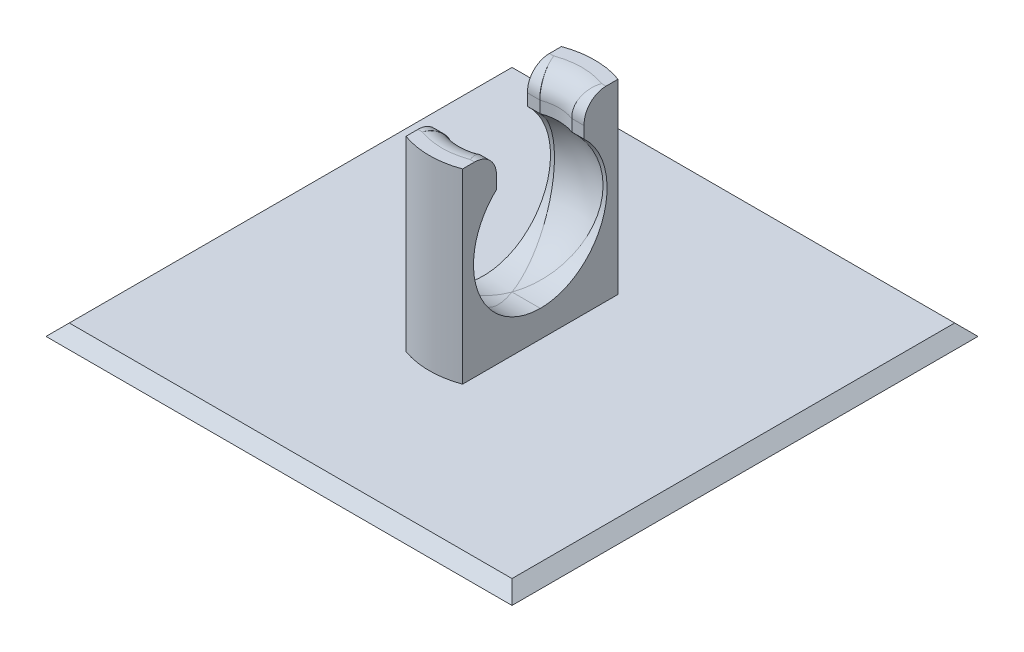
ISO-10303-21;
HEADER;
FILE_DESCRIPTION(('STEP AP214'),'2;1');
FILE_NAME('part.step','',(''),(''),'','','');
FILE_SCHEMA(('AUTOMOTIVE_DESIGN { 1 0 10303 214 1 1 1 1 }'));
ENDSEC;
DATA;
#1=APPLICATION_CONTEXT('core data for automotive mechanical design processes');
#2=APPLICATION_PROTOCOL_DEFINITION('international standard','automotive_design',2000,#1);
#3=PRODUCT_CONTEXT('',#1,'mechanical');
#4=PRODUCT('Part','Part','',(#3));
#5=PRODUCT_RELATED_PRODUCT_CATEGORY('part','',(#4));
#6=PRODUCT_DEFINITION_FORMATION('','',#4);
#7=PRODUCT_DEFINITION_CONTEXT('part definition',#1,'design');
#8=PRODUCT_DEFINITION('design','',#6,#7);
#9=PRODUCT_DEFINITION_SHAPE('','',#8);
#10=(LENGTH_UNIT() NAMED_UNIT(*) SI_UNIT(.MILLI.,.METRE.));
#11=(NAMED_UNIT(*) PLANE_ANGLE_UNIT() SI_UNIT($,.RADIAN.));
#12=(NAMED_UNIT(*) SI_UNIT($,.STERADIAN.) SOLID_ANGLE_UNIT());
#13=UNCERTAINTY_MEASURE_WITH_UNIT(LENGTH_MEASURE(1.E-05),#10,'distance_accuracy_value','');
#14=(GEOMETRIC_REPRESENTATION_CONTEXT(3) GLOBAL_UNCERTAINTY_ASSIGNED_CONTEXT((#13)) GLOBAL_UNIT_ASSIGNED_CONTEXT((#10,
#11,#12)) REPRESENTATION_CONTEXT('',''));
#15=CARTESIAN_POINT('',(0.,0.,0.));
#16=DIRECTION('',(0.,0.,1.));
#17=DIRECTION('',(1.,0.,0.));
#18=AXIS2_PLACEMENT_3D('',#15,#16,#17);
#19=CARTESIAN_POINT('',(0.,-42.,0.));
#20=DIRECTION('',(0.,-1.,0.));
#21=DIRECTION('',(0.,0.,-1.));
#22=AXIS2_PLACEMENT_3D('',#19,#20,#21);
#23=CYLINDRICAL_SURFACE('',#22,20.0312256240101);
#24=CARTESIAN_POINT('',(0.,28.,0.));
#25=DIRECTION('',(0.,-1.,0.));
#26=DIRECTION('',(0.,0.,-1.));
#27=AXIS2_PLACEMENT_3D('',#24,#25,#26);
#28=CIRCLE('',#27,20.0312256240101);
#29=CARTESIAN_POINT('',(6.85108265891278,28.,18.8231949041799));
#30=VERTEX_POINT('',#29);
#31=CARTESIAN_POINT('',(-6.85108265891277,28.,18.8231949041799));
#32=VERTEX_POINT('',#31);
#33=EDGE_CURVE('E491',#30,#32,#28,.T.);
#34=ORIENTED_EDGE('',*,*,#33,.F.);
#35=DIRECTION('',(0.,1.,0.));
#36=VECTOR('',#35,1.);
#37=CARTESIAN_POINT('',(6.85108265891276,0.,18.8231949041799));
#38=LINE('',#37,#36);
#39=CARTESIAN_POINT('',(6.85108265891277,23.,18.8231949041799));
#40=VERTEX_POINT('',#39);
#41=EDGE_CURVE('E484',#40,#30,#38,.T.);
#42=ORIENTED_EDGE('',*,*,#41,.F.);
#43=CARTESIAN_POINT('',(0.,23.,0.));
#44=DIRECTION('',(0.,-1.,0.));
#45=DIRECTION('',(0.,0.,-1.));
#46=AXIS2_PLACEMENT_3D('',#43,#44,#45);
#47=CIRCLE('',#46,20.0312256240101);
#48=CARTESIAN_POINT('',(-6.85108265891276,23.,18.8231949041799));
#49=VERTEX_POINT('',#48);
#50=EDGE_CURVE('E511',#40,#49,#47,.T.);
#51=ORIENTED_EDGE('',*,*,#50,.T.);
#52=DIRECTION('',(0.,1.,0.));
#53=VECTOR('',#52,1.);
#54=CARTESIAN_POINT('',(-6.85108265891276,0.,18.8231949041799));
#55=LINE('',#54,#53);
#56=EDGE_CURVE('E493',#49,#32,#55,.T.);
#57=ORIENTED_EDGE('',*,*,#56,.T.);
#58=EDGE_LOOP('',(#34,#42,#51,#57));
#59=FACE_BOUND('',#58,.T.);
#60=ADVANCED_FACE('F49',(#59),#23,.F.);
#61=CARTESIAN_POINT('',(0.,28.,0.));
#62=DIRECTION('',(0.,-1.,0.));
#63=DIRECTION('',(0.,0.,-1.));
#64=AXIS2_PLACEMENT_3D('',#61,#62,#63);
#65=TOROIDAL_SURFACE('',#64,30.0312256240101,10.);
#66=CARTESIAN_POINT('',(0.,38.,0.));
#67=DIRECTION('',(0.,-1.,0.));
#68=DIRECTION('',(0.,0.,-1.));
#69=AXIS2_PLACEMENT_3D('',#66,#67,#68);
#70=CIRCLE('',#69,30.0312256240101);
#71=CARTESIAN_POINT('',(10.2712840921695,38.,28.220121112039));
#72=VERTEX_POINT('',#71);
#73=CARTESIAN_POINT('',(-10.2712840921695,38.,28.220121112039));
#74=VERTEX_POINT('',#73);
#75=EDGE_CURVE('E497',#72,#74,#70,.T.);
#76=ORIENTED_EDGE('',*,*,#75,.F.);
#77=CARTESIAN_POINT('',(10.2712840921695,28.,28.220121112039));
#78=DIRECTION('',(0.939692620785908,0.,-0.342020143325669));
#79=DIRECTION('',(-0.342020143325669,0.,-0.939692620785908));
#80=AXIS2_PLACEMENT_3D('',#77,#78,#79);
#81=CIRCLE('',#80,10.);
#82=EDGE_CURVE('E470',#30,#72,#81,.T.);
#83=ORIENTED_EDGE('',*,*,#82,.F.);
#84=ORIENTED_EDGE('',*,*,#33,.T.);
#85=CARTESIAN_POINT('',(-10.2712840921695,28.,28.220121112039));
#86=DIRECTION('',(0.939692620785908,0.,0.342020143325669));
#87=DIRECTION('',(0.342020143325669,0.,-0.939692620785908));
#88=AXIS2_PLACEMENT_3D('',#85,#86,#87);
#89=CIRCLE('',#88,10.);
#90=EDGE_CURVE('E563',#32,#74,#89,.T.);
#91=ORIENTED_EDGE('',*,*,#90,.T.);
#92=EDGE_LOOP('',(#76,#83,#84,#91));
#93=FACE_BOUND('',#92,.T.);
#94=ADVANCED_FACE('F414',(#93),#65,.T.);
#95=CARTESIAN_POINT('',(0.,38.,0.));
#96=DIRECTION('',(0.,-1.,0.));
#97=DIRECTION('',(0.,0.,-1.));
#98=AXIS2_PLACEMENT_3D('',#95,#96,#97);
#99=PLANE('',#98);
#100=CARTESIAN_POINT('',(0.,38.,0.));
#101=DIRECTION('',(0.,-1.,0.));
#102=DIRECTION('',(0.,0.,-1.));
#103=AXIS2_PLACEMENT_3D('',#100,#101,#102);
#104=CIRCLE('',#103,35.5);
#105=CARTESIAN_POINT('',(12.1417150880613,38.,33.3590880378997));
#106=VERTEX_POINT('',#105);
#107=CARTESIAN_POINT('',(-12.1417150880613,38.,33.3590880378997));
#108=VERTEX_POINT('',#107);
#109=EDGE_CURVE('E517',#106,#108,#104,.T.);
#110=ORIENTED_EDGE('',*,*,#109,.F.);
#111=DIRECTION('',(0.,0.,1.));
#112=VECTOR('',#111,1.);
#113=CARTESIAN_POINT('',(12.1417150880613,38.0000000000001,1.86981339155973E-13));
#114=LINE('',#113,#112);
#115=CARTESIAN_POINT('',(12.1417150880613,38.,28.220121112039));
#116=VERTEX_POINT('',#115);
#117=EDGE_CURVE('E638',#116,#106,#114,.T.);
#118=ORIENTED_EDGE('',*,*,#117,.F.);
#119=DIRECTION('',(1.,0.,0.));
#120=VECTOR('',#119,1.);
#121=CARTESIAN_POINT('',(-85.7965231203002,38.,28.220121112039));
#122=LINE('',#121,#120);
#123=EDGE_CURVE('E481',#72,#116,#122,.T.);
#124=ORIENTED_EDGE('',*,*,#123,.F.);
#125=ORIENTED_EDGE('',*,*,#75,.T.);
#126=DIRECTION('',(-1.,0.,0.));
#127=VECTOR('',#126,1.);
#128=CARTESIAN_POINT('',(83.3870728119004,38.,28.220121112039));
#129=LINE('',#128,#127);
#130=CARTESIAN_POINT('',(-12.1417150880613,38.,28.220121112039));
#131=VERTEX_POINT('',#130);
#132=EDGE_CURVE('E346',#74,#131,#129,.T.);
#133=ORIENTED_EDGE('',*,*,#132,.T.);
#134=DIRECTION('',(0.,0.,-1.));
#135=VECTOR('',#134,1.);
#136=CARTESIAN_POINT('',(-12.1417150880613,38.0000000000001,1.02619056379434E-13));
#137=LINE('',#136,#135);
#138=EDGE_CURVE('E342',#108,#131,#137,.T.);
#139=ORIENTED_EDGE('',*,*,#138,.F.);
#140=EDGE_LOOP('',(#110,#118,#124,#125,#133,#139));
#141=FACE_BOUND('',#140,.T.);
#142=ADVANCED_FACE('F422',(#141),#99,.F.);
#143=CARTESIAN_POINT('',(0.,-42.,0.));
#144=DIRECTION('',(0.,-1.,0.));
#145=DIRECTION('',(0.,0.,-1.));
#146=AXIS2_PLACEMENT_3D('',#143,#144,#145);
#147=CYLINDRICAL_SURFACE('',#146,35.5);
#148=DIRECTION('',(0.,-1.,0.));
#149=VECTOR('',#148,1.);
#150=CARTESIAN_POINT('',(-12.1417150880613,0.,33.3590880378997));
#151=LINE('',#150,#149);
#152=CARTESIAN_POINT('',(-12.1417150880613,-42.,33.3590880378997));
#153=VERTEX_POINT('',#152);
#154=EDGE_CURVE('E571',#108,#153,#151,.T.);
#155=ORIENTED_EDGE('',*,*,#154,.T.);
#156=CARTESIAN_POINT('',(0.,-42.,0.));
#157=DIRECTION('',(0.,-1.,0.));
#158=DIRECTION('',(0.,0.,-1.));
#159=AXIS2_PLACEMENT_3D('',#156,#157,#158);
#160=CIRCLE('',#159,35.5);
#161=CARTESIAN_POINT('',(12.1417150880613,-42.,33.3590880378997));
#162=VERTEX_POINT('',#161);
#163=EDGE_CURVE('E514',#162,#153,#160,.T.);
#164=ORIENTED_EDGE('',*,*,#163,.F.);
#165=DIRECTION('',(0.,-1.,0.));
#166=VECTOR('',#165,1.);
#167=CARTESIAN_POINT('',(12.1417150880613,0.,33.3590880378997));
#168=LINE('',#167,#166);
#169=EDGE_CURVE('E500',#106,#162,#168,.T.);
#170=ORIENTED_EDGE('',*,*,#169,.F.);
#171=ORIENTED_EDGE('',*,*,#109,.T.);
#172=EDGE_LOOP('',(#155,#164,#170,#171));
#173=FACE_BOUND('',#172,.T.);
#174=ADVANCED_FACE('F418',(#173),#147,.T.);
#175=CARTESIAN_POINT('',(0.,0.,0.));
#176=DIRECTION('',(0.,-1.,0.));
#177=DIRECTION('',(0.342020143325669,0.,0.939692620785908));
#178=AXIS2_PLACEMENT_3D('',#175,#176,#177);
#179=SPHERICAL_SURFACE('',#178,30.5);
#180=CARTESIAN_POINT('',(0.,0.,0.));
#181=DIRECTION('',(0.939692620785908,0.,-0.342020143325669));
#182=DIRECTION('',(-0.342020143325669,0.,-0.939692620785908));
#183=AXIS2_PLACEMENT_3D('',#180,#181,#182);
#184=CIRCLE('',#183,30.5);
#185=CARTESIAN_POINT('',(0.,-30.5,0.));
#186=VERTEX_POINT('',#185);
#187=EDGE_CURVE('E504',#40,#186,#184,.T.);
#188=ORIENTED_EDGE('',*,*,#187,.T.);
#189=CARTESIAN_POINT('',(0.,0.,0.));
#190=DIRECTION('',(0.939692620785908,0.,0.342020143325669));
#191=DIRECTION('',(0.342020143325669,0.,-0.939692620785908));
#192=AXIS2_PLACEMENT_3D('',#189,#190,#191);
#193=CIRCLE('',#192,30.5);
#194=EDGE_CURVE('E488',#49,#186,#193,.T.);
#195=ORIENTED_EDGE('',*,*,#194,.F.);
#196=ORIENTED_EDGE('',*,*,#50,.F.);
#197=EDGE_LOOP('',(#188,#195,#196));
#198=FACE_BOUND('',#197,.T.);
#199=ADVANCED_FACE('F407',(#198),#179,.F.);
#200=CARTESIAN_POINT('',(12.1417150880613,-30.5,0.));
#201=DIRECTION('',(1.,0.,0.));
#202=DIRECTION('',(0.,0.,-1.));
#203=AXIS2_PLACEMENT_3D('',#200,#201,#202);
#204=PLANE('',#203);
#205=CARTESIAN_POINT('',(12.1417150880613,23.,-18.8231949041799));
#206=CARTESIAN_POINT('',(12.1417150880613,0.946783513735665,-42.6177763876831));
#207=CARTESIAN_POINT('',(12.1417150880613,-30.5,-31.5536841411673));
#208=CARTESIAN_POINT('',(12.1417150880613,-30.5,0.));
#209=(BOUNDED_CURVE() B_SPLINE_CURVE(3,(#205,#206,#207,#208),.UNSPECIFIED.,.F.,
.F.) B_SPLINE_CURVE_WITH_KNOTS((4,4),(0.,1.),
.UNSPECIFIED.) CURVE() GEOMETRIC_REPRESENTATION_ITEM() RATIONAL_B_SPLINE_CURVE((1.,
0.567095624439425,0.567095624439425,1.)) REPRESENTATION_ITEM(''));
#210=CARTESIAN_POINT('',(12.1417150880613,23.,-18.8231949041799));
#211=VERTEX_POINT('',#210);
#212=CARTESIAN_POINT('',(12.1417150880613,-30.5,0.));
#213=VERTEX_POINT('',#212);
#214=EDGE_CURVE('E283',#211,#213,#209,.T.);
#215=ORIENTED_EDGE('',*,*,#214,.T.);
#216=CARTESIAN_POINT('',(12.1417150880613,-30.5,0.));
#217=CARTESIAN_POINT('',(12.1417150880613,-30.5,31.5536841411673));
#218=CARTESIAN_POINT('',(12.1417150880613,0.94678351373564,42.6177763876831));
#219=CARTESIAN_POINT('',(12.1417150880613,23.,18.8231949041799));
#220=(BOUNDED_CURVE() B_SPLINE_CURVE(3,(#216,#217,#218,#219),.UNSPECIFIED.,.F.,
.F.) B_SPLINE_CURVE_WITH_KNOTS((4,4),(0.,1.),
.UNSPECIFIED.) CURVE() GEOMETRIC_REPRESENTATION_ITEM() RATIONAL_B_SPLINE_CURVE((1.,
0.567095624439425,0.567095624439425,1.)) REPRESENTATION_ITEM(''));
#221=CARTESIAN_POINT('',(12.1417150880613,23.,18.8231949041799));
#222=VERTEX_POINT('',#221);
#223=EDGE_CURVE('E585',#213,#222,#220,.T.);
#224=ORIENTED_EDGE('',*,*,#223,.T.);
#225=DIRECTION('',(0.,-1.,0.));
#226=VECTOR('',#225,1.);
#227=CARTESIAN_POINT('',(12.1417150880613,-30.5,18.8231949041798));
#228=LINE('',#227,#226);
#229=CARTESIAN_POINT('',(12.1417150880613,28.,18.8231949041799));
#230=VERTEX_POINT('',#229);
#231=EDGE_CURVE('E223',#230,#222,#228,.T.);
#232=ORIENTED_EDGE('',*,*,#231,.F.);
#233=CARTESIAN_POINT('',(12.1417150880613,28.5848888922025,28.220121112039));
#234=DIRECTION('',(1.,0.,0.));
#235=DIRECTION('',(0.,0.,-1.));
#236=AXIS2_PLACEMENT_3D('',#233,#234,#235);
#237=CIRCLE('',#236,9.41511110779745);
#238=EDGE_CURVE('E477',#230,#116,#237,.T.);
#239=ORIENTED_EDGE('',*,*,#238,.T.);
#240=ORIENTED_EDGE('',*,*,#117,.T.);
#241=ORIENTED_EDGE('',*,*,#169,.T.);
#242=DIRECTION('',(0.,0.,1.));
#243=VECTOR('',#242,1.);
#244=CARTESIAN_POINT('',(12.1417150880613,-42.,0.));
#245=LINE('',#244,#243);
#246=CARTESIAN_POINT('',(12.1417150880613,-42.,-33.3590880378997));
#247=VERTEX_POINT('',#246);
#248=EDGE_CURVE('E540',#247,#162,#245,.T.);
#249=ORIENTED_EDGE('',*,*,#248,.F.);
#250=DIRECTION('',(0.,-1.,0.));
#251=VECTOR('',#250,1.);
#252=CARTESIAN_POINT('',(12.1417150880613,0.,-33.3590880378997));
#253=LINE('',#252,#251);
#254=CARTESIAN_POINT('',(12.1417150880613,38.,-33.3590880378997));
#255=VERTEX_POINT('',#254);
#256=EDGE_CURVE('E550',#255,#247,#253,.T.);
#257=ORIENTED_EDGE('',*,*,#256,.F.);
#258=DIRECTION('',(0.,0.,-1.));
#259=VECTOR('',#258,1.);
#260=CARTESIAN_POINT('',(12.1417150880613,38.0000000000001,0.));
#261=LINE('',#260,#259);
#262=CARTESIAN_POINT('',(12.1417150880613,38.,-28.220121112039));
#263=VERTEX_POINT('',#262);
#264=EDGE_CURVE('E279',#263,#255,#261,.T.);
#265=ORIENTED_EDGE('',*,*,#264,.F.);
#266=CARTESIAN_POINT('',(12.1417150880613,28.5848888922026,-28.220121112039));
#267=DIRECTION('',(1.,0.,0.));
#268=DIRECTION('',(0.,0.,-1.));
#269=AXIS2_PLACEMENT_3D('',#266,#267,#268);
#270=CIRCLE('',#269,9.41511110779743);
#271=CARTESIAN_POINT('',(12.1417150880613,28.,-18.8231949041799));
#272=VERTEX_POINT('',#271);
#273=EDGE_CURVE('E275',#263,#272,#270,.T.);
#274=ORIENTED_EDGE('',*,*,#273,.T.);
#275=DIRECTION('',(0.,1.,0.));
#276=VECTOR('',#275,1.);
#277=CARTESIAN_POINT('',(12.1417150880613,-30.5,-18.8231949041798));
#278=LINE('',#277,#276);
#279=EDGE_CURVE('E227',#211,#272,#278,.T.);
#280=ORIENTED_EDGE('',*,*,#279,.F.);
#281=EDGE_LOOP('',(#215,#224,#232,#239,#240,#241,#249,#257,#265,#274,#280));
#282=FACE_BOUND('',#281,.T.);
#283=ADVANCED_FACE('F404',(#282),#204,.T.);
#284=CARTESIAN_POINT('',(-12.1417150880613,-30.5,33.3590880378997));
#285=DIRECTION('',(-1.,0.,0.));
#286=DIRECTION('',(0.,0.,1.));
#287=AXIS2_PLACEMENT_3D('',#284,#285,#286);
#288=PLANE('',#287);
#289=DIRECTION('',(0.,-1.,0.));
#290=VECTOR('',#289,1.);
#291=CARTESIAN_POINT('',(-12.1417150880613,0.,-33.3590880378997));
#292=LINE('',#291,#290);
#293=CARTESIAN_POINT('',(-12.1417150880613,38.,-33.3590880378997));
#294=VERTEX_POINT('',#293);
#295=CARTESIAN_POINT('',(-12.1417150880613,-42.,-33.3590880378997));
#296=VERTEX_POINT('',#295);
#297=EDGE_CURVE('E595',#294,#296,#292,.T.);
#298=ORIENTED_EDGE('',*,*,#297,.T.);
#299=DIRECTION('',(0.,0.,-1.));
#300=VECTOR('',#299,1.);
#301=CARTESIAN_POINT('',(-12.1417150880613,-42.,33.3590880378997));
#302=LINE('',#301,#300);
#303=EDGE_CURVE('E542',#153,#296,#302,.T.);
#304=ORIENTED_EDGE('',*,*,#303,.F.);
#305=ORIENTED_EDGE('',*,*,#154,.F.);
#306=ORIENTED_EDGE('',*,*,#138,.T.);
#307=CARTESIAN_POINT('',(-12.1417150880613,28.5848888922025,28.220121112039));
#308=DIRECTION('',(-1.,0.,0.));
#309=DIRECTION('',(0.,0.,1.));
#310=AXIS2_PLACEMENT_3D('',#307,#308,#309);
#311=CIRCLE('',#310,9.41511110779745);
#312=CARTESIAN_POINT('',(-12.1417150880613,28.,18.8231949041799));
#313=VERTEX_POINT('',#312);
#314=EDGE_CURVE('E337',#313,#131,#311,.F.);
#315=ORIENTED_EDGE('',*,*,#314,.F.);
#316=DIRECTION('',(0.,1.,0.));
#317=VECTOR('',#316,1.);
#318=CARTESIAN_POINT('',(-12.1417150880613,0.,18.8231949041799));
#319=LINE('',#318,#317);
#320=CARTESIAN_POINT('',(-12.1417150880613,23.,18.8231949041799));
#321=VERTEX_POINT('',#320);
#322=EDGE_CURVE('E331',#321,#313,#319,.T.);
#323=ORIENTED_EDGE('',*,*,#322,.F.);
#324=CARTESIAN_POINT('',(-12.1417150880613,0.,0.));
#325=DIRECTION('',(-1.,0.,0.));
#326=DIRECTION('',(0.,-1.,0.));
#327=AXIS2_PLACEMENT_3D('',#324,#325,#326);
#328=ELLIPSE('',#327,30.5,28.6606249339702);
#329=CARTESIAN_POINT('',(-12.1417150880613,23.,-18.8231949041799));
#330=VERTEX_POINT('',#329);
#331=EDGE_CURVE('E335',#330,#321,#328,.T.);
#332=ORIENTED_EDGE('',*,*,#331,.F.);
#333=DIRECTION('',(0.,-1.,0.));
#334=VECTOR('',#333,1.);
#335=CARTESIAN_POINT('',(-12.1417150880613,0.,-18.8231949041798));
#336=LINE('',#335,#334);
#337=CARTESIAN_POINT('',(-12.1417150880613,28.,-18.8231949041799));
#338=VERTEX_POINT('',#337);
#339=EDGE_CURVE('E315',#338,#330,#336,.T.);
#340=ORIENTED_EDGE('',*,*,#339,.F.);
#341=CARTESIAN_POINT('',(-12.1417150880613,28.5848888922026,-28.220121112039));
#342=DIRECTION('',(-1.,0.,0.));
#343=DIRECTION('',(0.,0.,1.));
#344=AXIS2_PLACEMENT_3D('',#341,#342,#343);
#345=CIRCLE('',#344,9.41511110779743);
#346=CARTESIAN_POINT('',(-12.1417150880613,38.,-28.220121112039));
#347=VERTEX_POINT('',#346);
#348=EDGE_CURVE('E310',#347,#338,#345,.F.);
#349=ORIENTED_EDGE('',*,*,#348,.F.);
#350=DIRECTION('',(0.,0.,1.));
#351=VECTOR('',#350,1.);
#352=CARTESIAN_POINT('',(-12.1417150880613,38.,0.));
#353=LINE('',#352,#351);
#354=EDGE_CURVE('E305',#294,#347,#353,.T.);
#355=ORIENTED_EDGE('',*,*,#354,.F.);
#356=EDGE_LOOP('',(#298,#304,#305,#306,#315,#323,#332,#340,#349,#355));
#357=FACE_BOUND('',#356,.T.);
#358=ADVANCED_FACE('F388',(#357),#288,.T.);
#359=CARTESIAN_POINT('',(0.,-42.,0.));
#360=DIRECTION('',(0.,-1.,0.));
#361=DIRECTION('',(0.,0.,1.));
#362=AXIS2_PLACEMENT_3D('',#359,#360,#361);
#363=CYLINDRICAL_SURFACE('',#362,20.0312256240101);
#364=CARTESIAN_POINT('',(0.,28.,0.));
#365=DIRECTION('',(0.,1.,0.));
#366=DIRECTION('',(0.,0.,1.));
#367=AXIS2_PLACEMENT_3D('',#364,#365,#366);
#368=CIRCLE('',#367,20.0312256240101);
#369=CARTESIAN_POINT('',(6.85108265891277,28.,-18.8231949041799));
#370=VERTEX_POINT('',#369);
#371=CARTESIAN_POINT('',(-6.85108265891277,28.,-18.8231949041799));
#372=VERTEX_POINT('',#371);
#373=EDGE_CURVE('E565',#370,#372,#368,.T.);
#374=ORIENTED_EDGE('',*,*,#373,.T.);
#375=DIRECTION('',(0.,1.,0.));
#376=VECTOR('',#375,1.);
#377=CARTESIAN_POINT('',(-6.85108265891275,0.,-18.8231949041799));
#378=LINE('',#377,#376);
#379=CARTESIAN_POINT('',(-6.85108265891276,23.,-18.8231949041799));
#380=VERTEX_POINT('',#379);
#381=EDGE_CURVE('E350',#380,#372,#378,.T.);
#382=ORIENTED_EDGE('',*,*,#381,.F.);
#383=CARTESIAN_POINT('',(0.,23.,0.));
#384=DIRECTION('',(0.,1.,0.));
#385=DIRECTION('',(0.,0.,1.));
#386=AXIS2_PLACEMENT_3D('',#383,#384,#385);
#387=CIRCLE('',#386,20.0312256240101);
#388=CARTESIAN_POINT('',(6.85108265891277,23.,-18.8231949041799));
#389=VERTEX_POINT('',#388);
#390=EDGE_CURVE('E547',#389,#380,#387,.T.);
#391=ORIENTED_EDGE('',*,*,#390,.F.);
#392=DIRECTION('',(0.,1.,0.));
#393=VECTOR('',#392,1.);
#394=CARTESIAN_POINT('',(6.85108265891276,0.,-18.8231949041799));
#395=LINE('',#394,#393);
#396=EDGE_CURVE('E594',#389,#370,#395,.T.);
#397=ORIENTED_EDGE('',*,*,#396,.T.);
#398=EDGE_LOOP('',(#374,#382,#391,#397));
#399=FACE_BOUND('',#398,.T.);
#400=ADVANCED_FACE('F384',(#399),#363,.F.);
#401=CARTESIAN_POINT('',(0.,28.,0.));
#402=DIRECTION('',(0.,-1.,0.));
#403=DIRECTION('',(0.,0.,1.));
#404=AXIS2_PLACEMENT_3D('',#401,#402,#403);
#405=TOROIDAL_SURFACE('',#404,30.0312256240101,10.);
#406=CARTESIAN_POINT('',(0.,38.,0.));
#407=DIRECTION('',(0.,1.,0.));
#408=DIRECTION('',(0.,0.,1.));
#409=AXIS2_PLACEMENT_3D('',#406,#407,#408);
#410=CIRCLE('',#409,30.0312256240101);
#411=CARTESIAN_POINT('',(10.2712840921695,38.,-28.220121112039));
#412=VERTEX_POINT('',#411);
#413=CARTESIAN_POINT('',(-10.2712840921694,38.,-28.220121112039));
#414=VERTEX_POINT('',#413);
#415=EDGE_CURVE('E611',#412,#414,#410,.T.);
#416=ORIENTED_EDGE('',*,*,#415,.T.);
#417=CARTESIAN_POINT('',(-10.2712840921695,28.,-28.220121112039));
#418=DIRECTION('',(-0.939692620785908,0.,0.342020143325669));
#419=DIRECTION('',(0.342020143325669,0.,0.939692620785908));
#420=AXIS2_PLACEMENT_3D('',#417,#418,#419);
#421=CIRCLE('',#420,10.);
#422=EDGE_CURVE('E601',#372,#414,#421,.T.);
#423=ORIENTED_EDGE('',*,*,#422,.F.);
#424=ORIENTED_EDGE('',*,*,#373,.F.);
#425=CARTESIAN_POINT('',(10.2712840921695,28.,-28.220121112039));
#426=DIRECTION('',(-0.939692620785908,0.,-0.34202014332567));
#427=DIRECTION('',(-0.34202014332567,0.,0.939692620785908));
#428=AXIS2_PLACEMENT_3D('',#425,#426,#427);
#429=CIRCLE('',#428,10.);
#430=EDGE_CURVE('E555',#370,#412,#429,.T.);
#431=ORIENTED_EDGE('',*,*,#430,.T.);
#432=EDGE_LOOP('',(#416,#423,#424,#431));
#433=FACE_BOUND('',#432,.T.);
#434=ADVANCED_FACE('F387',(#433),#405,.T.);
#435=CARTESIAN_POINT('',(0.,38.,0.));
#436=DIRECTION('',(0.,-1.,0.));
#437=DIRECTION('',(0.,0.,1.));
#438=AXIS2_PLACEMENT_3D('',#435,#436,#437);
#439=PLANE('',#438);
#440=CARTESIAN_POINT('',(0.,38.,0.));
#441=DIRECTION('',(0.,1.,0.));
#442=DIRECTION('',(0.,0.,1.));
#443=AXIS2_PLACEMENT_3D('',#440,#441,#442);
#444=CIRCLE('',#443,35.5);
#445=EDGE_CURVE('E546',#255,#294,#444,.T.);
#446=ORIENTED_EDGE('',*,*,#445,.T.);
#447=ORIENTED_EDGE('',*,*,#354,.T.);
#448=DIRECTION('',(-1.,0.,0.));
#449=VECTOR('',#448,1.);
#450=CARTESIAN_POINT('',(83.3870728119004,38.,-28.220121112039));
#451=LINE('',#450,#449);
#452=EDGE_CURVE('E314',#414,#347,#451,.T.);
#453=ORIENTED_EDGE('',*,*,#452,.F.);
#454=ORIENTED_EDGE('',*,*,#415,.F.);
#455=DIRECTION('',(1.,0.,0.));
#456=VECTOR('',#455,1.);
#457=CARTESIAN_POINT('',(-85.7965231203002,38.,-28.220121112039));
#458=LINE('',#457,#456);
#459=EDGE_CURVE('E299',#412,#263,#458,.T.);
#460=ORIENTED_EDGE('',*,*,#459,.T.);
#461=ORIENTED_EDGE('',*,*,#264,.T.);
#462=EDGE_LOOP('',(#446,#447,#453,#454,#460,#461));
#463=FACE_BOUND('',#462,.T.);
#464=ADVANCED_FACE('F396',(#463),#439,.F.);
#465=CARTESIAN_POINT('',(0.,-42.,0.));
#466=DIRECTION('',(0.,-1.,0.));
#467=DIRECTION('',(0.,0.,1.));
#468=AXIS2_PLACEMENT_3D('',#465,#466,#467);
#469=CYLINDRICAL_SURFACE('',#468,35.5);
#470=ORIENTED_EDGE('',*,*,#297,.F.);
#471=ORIENTED_EDGE('',*,*,#445,.F.);
#472=ORIENTED_EDGE('',*,*,#256,.T.);
#473=CARTESIAN_POINT('',(0.,-42.,0.));
#474=DIRECTION('',(0.,1.,0.));
#475=DIRECTION('',(0.,0.,1.));
#476=AXIS2_PLACEMENT_3D('',#473,#474,#475);
#477=CIRCLE('',#476,35.5);
#478=EDGE_CURVE('E537',#247,#296,#477,.T.);
#479=ORIENTED_EDGE('',*,*,#478,.T.);
#480=EDGE_LOOP('',(#470,#471,#472,#479));
#481=FACE_BOUND('',#480,.T.);
#482=ADVANCED_FACE('F392',(#481),#469,.T.);
#483=CARTESIAN_POINT('',(0.,0.,0.));
#484=DIRECTION('',(0.,-1.,0.));
#485=DIRECTION('',(0.34202014332567,0.,-0.939692620785908));
#486=AXIS2_PLACEMENT_3D('',#483,#484,#485);
#487=SPHERICAL_SURFACE('',#486,30.5);
#488=CARTESIAN_POINT('',(0.,0.,0.));
#489=DIRECTION('',(-0.939692620785908,0.,-0.34202014332567));
#490=DIRECTION('',(-0.34202014332567,0.,0.939692620785908));
#491=AXIS2_PLACEMENT_3D('',#488,#489,#490);
#492=CIRCLE('',#491,30.5);
#493=EDGE_CURVE('E554',#389,#186,#492,.T.);
#494=ORIENTED_EDGE('',*,*,#493,.F.);
#495=ORIENTED_EDGE('',*,*,#390,.T.);
#496=CARTESIAN_POINT('',(0.,0.,0.));
#497=DIRECTION('',(-0.939692620785908,0.,0.342020143325669));
#498=DIRECTION('',(0.342020143325669,0.,0.939692620785908));
#499=AXIS2_PLACEMENT_3D('',#496,#497,#498);
#500=CIRCLE('',#499,30.5);
#501=EDGE_CURVE('E580',#380,#186,#500,.T.);
#502=ORIENTED_EDGE('',*,*,#501,.T.);
#503=EDGE_LOOP('',(#494,#495,#502));
#504=FACE_BOUND('',#503,.T.);
#505=ADVANCED_FACE('F382',(#504),#487,.F.);
#506=CARTESIAN_POINT('',(0.,0.,0.));
#507=DIRECTION('',(0.939692620785908,0.,0.342020143325669));
#508=DIRECTION('',(0.342020143325669,0.,-0.939692620785908));
#509=AXIS2_PLACEMENT_3D('',#506,#507,#508);
#510=PLANE('',#509);
#511=ORIENTED_EDGE('',*,*,#90,.F.);
#512=CARTESIAN_POINT('',(-10.2712840921695,28.5848888922025,28.220121112039));
#513=DIRECTION('',(0.939692620785908,0.,0.342020143325669));
#514=DIRECTION('',(-0.342020143325669,0.,0.939692620785908));
#515=AXIS2_PLACEMENT_3D('',#512,#513,#514);
#516=ELLIPSE('',#515,10.0193519663091,9.41511110779745);
#517=EDGE_CURVE('E309',#32,#74,#516,.T.);
#518=ORIENTED_EDGE('',*,*,#517,.T.);
#519=EDGE_LOOP('',(#511,#518));
#520=FACE_BOUND('',#519,.T.);
#521=ADVANCED_FACE('F378',(#520),#510,.T.);
#522=CARTESIAN_POINT('',(83.3870728119004,28.5848888922025,28.220121112039));
#523=DIRECTION('',(-1.,0.,0.));
#524=DIRECTION('',(0.,0.,1.));
#525=AXIS2_PLACEMENT_3D('',#522,#523,#524);
#526=CYLINDRICAL_SURFACE('',#525,9.41511110779745);
#527=ORIENTED_EDGE('',*,*,#517,.F.);
#528=DIRECTION('',(-1.,0.,0.));
#529=VECTOR('',#528,1.);
#530=CARTESIAN_POINT('',(83.3870728119004,28.,18.8231949041799));
#531=LINE('',#530,#529);
#532=EDGE_CURVE('E341',#32,#313,#531,.T.);
#533=ORIENTED_EDGE('',*,*,#532,.T.);
#534=ORIENTED_EDGE('',*,*,#314,.T.);
#535=ORIENTED_EDGE('',*,*,#132,.F.);
#536=EDGE_LOOP('',(#527,#533,#534,#535));
#537=FACE_BOUND('',#536,.T.);
#538=ADVANCED_FACE('F374',(#537),#526,.T.);
#539=CARTESIAN_POINT('',(83.3870728119004,0.,18.8231949041799));
#540=DIRECTION('',(0.,0.,1.));
#541=DIRECTION('',(0.,-1.,0.));
#542=AXIS2_PLACEMENT_3D('',#539,#540,#541);
#543=PLANE('',#542);
#544=ORIENTED_EDGE('',*,*,#56,.F.);
#545=DIRECTION('',(-1.,0.,0.));
#546=VECTOR('',#545,1.);
#547=CARTESIAN_POINT('',(83.3870728119004,23.,18.8231949041799));
#548=LINE('',#547,#546);
#549=EDGE_CURVE('E336',#49,#321,#548,.T.);
#550=ORIENTED_EDGE('',*,*,#549,.T.);
#551=ORIENTED_EDGE('',*,*,#322,.T.);
#552=ORIENTED_EDGE('',*,*,#532,.F.);
#553=EDGE_LOOP('',(#544,#550,#551,#552));
#554=FACE_BOUND('',#553,.T.);
#555=ADVANCED_FACE('F369',(#554),#543,.F.);
#556=CARTESIAN_POINT('',(83.3870728119004,0.,0.));
#557=DIRECTION('',(-1.,0.,0.));
#558=DIRECTION('',(0.,-1.,0.));
#559=AXIS2_PLACEMENT_3D('',#556,#557,#558);
#560=ELLIPSE('',#559,30.5,28.6606249339702);
#561=DIRECTION('',(-1.,0.,0.));
#562=VECTOR('',#561,1.);
#563=SURFACE_OF_LINEAR_EXTRUSION('',#560,#562);
#564=ORIENTED_EDGE('',*,*,#194,.T.);
#565=ORIENTED_EDGE('',*,*,#501,.F.);
#566=DIRECTION('',(-1.,0.,0.));
#567=VECTOR('',#566,1.);
#568=CARTESIAN_POINT('',(83.3870728119004,23.,-18.8231949041799));
#569=LINE('',#568,#567);
#570=EDGE_CURVE('E323',#380,#330,#569,.T.);
#571=ORIENTED_EDGE('',*,*,#570,.T.);
#572=ORIENTED_EDGE('',*,*,#331,.T.);
#573=ORIENTED_EDGE('',*,*,#549,.F.);
#574=EDGE_LOOP('',(#564,#565,#571,#572,#573));
#575=FACE_BOUND('',#574,.T.);
#576=ADVANCED_FACE('F364',(#575),#563,.F.);
#577=CARTESIAN_POINT('',(0.,0.,0.));
#578=DIRECTION('',(0.939692620785908,0.,-0.342020143325669));
#579=DIRECTION('',(0.342020143325669,0.,0.939692620785908));
#580=AXIS2_PLACEMENT_3D('',#577,#578,#579);
#581=PLANE('',#580);
#582=ORIENTED_EDGE('',*,*,#422,.T.);
#583=CARTESIAN_POINT('',(-10.2712840921695,28.5848888922026,-28.220121112039));
#584=DIRECTION('',(0.939692620785908,0.,-0.342020143325669));
#585=DIRECTION('',(-0.342020143325669,0.,-0.939692620785908));
#586=AXIS2_PLACEMENT_3D('',#583,#584,#585);
#587=ELLIPSE('',#586,10.0193519663091,9.41511110779743);
#588=EDGE_CURVE('E320',#414,#372,#587,.T.);
#589=ORIENTED_EDGE('',*,*,#588,.T.);
#590=EDGE_LOOP('',(#582,#589));
#591=FACE_BOUND('',#590,.T.);
#592=ADVANCED_FACE('F368',(#591),#581,.T.);
#593=CARTESIAN_POINT('',(83.3870728119004,0.,-18.8231949041798));
#594=DIRECTION('',(0.,0.,-1.));
#595=DIRECTION('',(0.,1.,0.));
#596=AXIS2_PLACEMENT_3D('',#593,#594,#595);
#597=PLANE('',#596);
#598=ORIENTED_EDGE('',*,*,#381,.T.);
#599=DIRECTION('',(-1.,0.,0.));
#600=VECTOR('',#599,1.);
#601=CARTESIAN_POINT('',(83.3870728119004,28.,-18.8231949041799));
#602=LINE('',#601,#600);
#603=EDGE_CURVE('E319',#372,#338,#602,.T.);
#604=ORIENTED_EDGE('',*,*,#603,.T.);
#605=ORIENTED_EDGE('',*,*,#339,.T.);
#606=ORIENTED_EDGE('',*,*,#570,.F.);
#607=EDGE_LOOP('',(#598,#604,#605,#606));
#608=FACE_BOUND('',#607,.T.);
#609=ADVANCED_FACE('F626',(#608),#597,.F.);
#610=CARTESIAN_POINT('',(83.3870728119004,28.5848888922026,-28.220121112039));
#611=DIRECTION('',(-1.,0.,0.));
#612=DIRECTION('',(0.,0.,1.));
#613=AXIS2_PLACEMENT_3D('',#610,#611,#612);
#614=CYLINDRICAL_SURFACE('',#613,9.41511110779743);
#615=ORIENTED_EDGE('',*,*,#588,.F.);
#616=ORIENTED_EDGE('',*,*,#452,.T.);
#617=ORIENTED_EDGE('',*,*,#348,.T.);
#618=ORIENTED_EDGE('',*,*,#603,.F.);
#619=EDGE_LOOP('',(#615,#616,#617,#618));
#620=FACE_BOUND('',#619,.T.);
#621=ADVANCED_FACE('F254',(#620),#614,.T.);
#622=CARTESIAN_POINT('',(0.,0.,0.));
#623=DIRECTION('',(0.939692620785908,0.,0.34202014332567));
#624=DIRECTION('',(-0.34202014332567,0.,0.939692620785908));
#625=AXIS2_PLACEMENT_3D('',#622,#623,#624);
#626=PLANE('',#625);
#627=CARTESIAN_POINT('',(10.2712840921695,28.5848888922026,-28.220121112039));
#628=DIRECTION('',(0.939692620785908,0.,0.34202014332567));
#629=DIRECTION('',(0.34202014332567,0.,-0.939692620785908));
#630=AXIS2_PLACEMENT_3D('',#627,#628,#629);
#631=ELLIPSE('',#630,10.0193519663091,9.41511110779743);
#632=EDGE_CURVE('E267',#370,#412,#631,.F.);
#633=ORIENTED_EDGE('',*,*,#632,.T.);
#634=ORIENTED_EDGE('',*,*,#430,.F.);
#635=EDGE_LOOP('',(#633,#634));
#636=FACE_BOUND('',#635,.T.);
#637=ADVANCED_FACE('F250',(#636),#626,.F.);
#638=CARTESIAN_POINT('',(-85.7965231203002,23.,-18.8231949041799));
#639=CARTESIAN_POINT('',(-85.7965231203002,0.946783513735665,-42.6177763876831));
#640=CARTESIAN_POINT('',(-85.7965231203002,-30.5,-31.5536841411673));
#641=CARTESIAN_POINT('',(-85.7965231203002,-30.5,0.));
#642=(BOUNDED_CURVE() B_SPLINE_CURVE(3,(#638,#639,#640,#641),.UNSPECIFIED.,.F.,
.F.) B_SPLINE_CURVE_WITH_KNOTS((4,4),(0.,1.),
.UNSPECIFIED.) CURVE() GEOMETRIC_REPRESENTATION_ITEM() RATIONAL_B_SPLINE_CURVE((1.,
0.567095624439425,0.567095624439425,1.)) REPRESENTATION_ITEM(''));
#643=DIRECTION('',(1.,0.,0.));
#644=VECTOR('',#643,1.);
#645=SURFACE_OF_LINEAR_EXTRUSION('',#642,#644);
#646=ORIENTED_EDGE('',*,*,#493,.T.);
#647=DIRECTION('',(1.,0.,0.));
#648=VECTOR('',#647,1.);
#649=CARTESIAN_POINT('',(-85.7965231203002,-30.5,0.));
#650=LINE('',#649,#648);
#651=EDGE_CURVE('E295',#186,#213,#650,.T.);
#652=ORIENTED_EDGE('',*,*,#651,.T.);
#653=ORIENTED_EDGE('',*,*,#214,.F.);
#654=DIRECTION('',(1.,0.,0.));
#655=VECTOR('',#654,1.);
#656=CARTESIAN_POINT('',(-85.7965231203002,23.,-18.8231949041799));
#657=LINE('',#656,#655);
#658=EDGE_CURVE('E289',#389,#211,#657,.T.);
#659=ORIENTED_EDGE('',*,*,#658,.F.);
#660=EDGE_LOOP('',(#646,#652,#653,#659));
#661=FACE_BOUND('',#660,.T.);
#662=ADVANCED_FACE('F253',(#661),#645,.T.);
#663=CARTESIAN_POINT('',(-85.7965231203002,28.5848888922026,-28.220121112039));
#664=DIRECTION('',(1.,0.,0.));
#665=DIRECTION('',(0.,0.,-1.));
#666=AXIS2_PLACEMENT_3D('',#663,#664,#665);
#667=CYLINDRICAL_SURFACE('',#666,9.41511110779743);
#668=ORIENTED_EDGE('',*,*,#632,.F.);
#669=DIRECTION('',(1.,0.,0.));
#670=VECTOR('',#669,1.);
#671=CARTESIAN_POINT('',(-85.7965231203002,28.,-18.8231949041799));
#672=LINE('',#671,#670);
#673=EDGE_CURVE('E302',#370,#272,#672,.T.);
#674=ORIENTED_EDGE('',*,*,#673,.T.);
#675=ORIENTED_EDGE('',*,*,#273,.F.);
#676=ORIENTED_EDGE('',*,*,#459,.F.);
#677=EDGE_LOOP('',(#668,#674,#675,#676));
#678=FACE_BOUND('',#677,.T.);
#679=ADVANCED_FACE('F259',(#678),#667,.T.);
#680=CARTESIAN_POINT('',(-85.7965231203002,-30.5,-18.8231949041798));
#681=DIRECTION('',(0.,0.,-1.));
#682=DIRECTION('',(0.,1.,0.));
#683=AXIS2_PLACEMENT_3D('',#680,#681,#682);
#684=PLANE('',#683);
#685=ORIENTED_EDGE('',*,*,#673,.F.);
#686=ORIENTED_EDGE('',*,*,#396,.F.);
#687=ORIENTED_EDGE('',*,*,#658,.T.);
#688=ORIENTED_EDGE('',*,*,#279,.T.);
#689=EDGE_LOOP('',(#685,#686,#687,#688));
#690=FACE_BOUND('',#689,.T.);
#691=ADVANCED_FACE('F459',(#690),#684,.F.);
#692=CARTESIAN_POINT('',(0.,0.,0.));
#693=DIRECTION('',(0.939692620785908,0.,-0.342020143325669));
#694=DIRECTION('',(-0.342020143325669,0.,-0.939692620785908));
#695=AXIS2_PLACEMENT_3D('',#692,#693,#694);
#696=PLANE('',#695);
#697=CARTESIAN_POINT('',(10.2712840921695,28.5848888922025,28.220121112039));
#698=DIRECTION('',(0.939692620785908,0.,-0.342020143325669));
#699=DIRECTION('',(0.34202014332567,0.,0.939692620785908));
#700=AXIS2_PLACEMENT_3D('',#697,#698,#699);
#701=ELLIPSE('',#700,10.0193519663091,9.41511110779745);
#702=EDGE_CURVE('E224',#72,#30,#701,.F.);
#703=ORIENTED_EDGE('',*,*,#702,.T.);
#704=ORIENTED_EDGE('',*,*,#82,.T.);
#705=EDGE_LOOP('',(#703,#704));
#706=FACE_BOUND('',#705,.T.);
#707=ADVANCED_FACE('F457',(#706),#696,.F.);
#708=CARTESIAN_POINT('',(-85.7965231203002,28.5848888922025,28.220121112039));
#709=DIRECTION('',(1.,0.,0.));
#710=DIRECTION('',(0.,0.,-1.));
#711=AXIS2_PLACEMENT_3D('',#708,#709,#710);
#712=CYLINDRICAL_SURFACE('',#711,9.41511110779745);
#713=ORIENTED_EDGE('',*,*,#702,.F.);
#714=ORIENTED_EDGE('',*,*,#123,.T.);
#715=ORIENTED_EDGE('',*,*,#238,.F.);
#716=DIRECTION('',(1.,0.,0.));
#717=VECTOR('',#716,1.);
#718=CARTESIAN_POINT('',(-85.7965231203002,28.,18.8231949041799));
#719=LINE('',#718,#717);
#720=EDGE_CURVE('E474',#30,#230,#719,.T.);
#721=ORIENTED_EDGE('',*,*,#720,.F.);
#722=EDGE_LOOP('',(#713,#714,#715,#721));
#723=FACE_BOUND('',#722,.T.);
#724=ADVANCED_FACE('F243',(#723),#712,.T.);
#725=CARTESIAN_POINT('',(-85.7965231203002,-30.5,0.));
#726=CARTESIAN_POINT('',(-85.7965231203002,-30.5,31.5536841411673));
#727=CARTESIAN_POINT('',(-85.7965231203002,0.94678351373564,42.6177763876831));
#728=CARTESIAN_POINT('',(-85.7965231203002,23.,18.8231949041799));
#729=(BOUNDED_CURVE() B_SPLINE_CURVE(3,(#725,#726,#727,#728),.UNSPECIFIED.,.F.,
.F.) B_SPLINE_CURVE_WITH_KNOTS((4,4),(0.,1.),
.UNSPECIFIED.) CURVE() GEOMETRIC_REPRESENTATION_ITEM() RATIONAL_B_SPLINE_CURVE((1.,
0.567095624439425,0.567095624439425,1.)) REPRESENTATION_ITEM(''));
#730=DIRECTION('',(1.,0.,0.));
#731=VECTOR('',#730,1.);
#732=SURFACE_OF_LINEAR_EXTRUSION('',#729,#731);
#733=ORIENTED_EDGE('',*,*,#187,.F.);
#734=DIRECTION('',(1.,0.,0.));
#735=VECTOR('',#734,1.);
#736=CARTESIAN_POINT('',(-85.7965231203002,23.,18.8231949041799));
#737=LINE('',#736,#735);
#738=EDGE_CURVE('E228',#40,#222,#737,.T.);
#739=ORIENTED_EDGE('',*,*,#738,.T.);
#740=ORIENTED_EDGE('',*,*,#223,.F.);
#741=ORIENTED_EDGE('',*,*,#651,.F.);
#742=EDGE_LOOP('',(#733,#739,#740,#741));
#743=FACE_BOUND('',#742,.T.);
#744=ADVANCED_FACE('F238',(#743),#732,.T.);
#745=CARTESIAN_POINT('',(-85.7965231203002,-30.5,18.8231949041798));
#746=DIRECTION('',(0.,0.,1.));
#747=DIRECTION('',(0.,-1.,0.));
#748=AXIS2_PLACEMENT_3D('',#745,#746,#747);
#749=PLANE('',#748);
#750=ORIENTED_EDGE('',*,*,#738,.F.);
#751=ORIENTED_EDGE('',*,*,#41,.T.);
#752=ORIENTED_EDGE('',*,*,#720,.T.);
#753=ORIENTED_EDGE('',*,*,#231,.T.);
#754=EDGE_LOOP('',(#750,#751,#752,#753));
#755=FACE_BOUND('',#754,.T.);
#756=ADVANCED_FACE('F242',(#755),#749,.F.);
#757=CARTESIAN_POINT('',(0.,-42.,0.));
#758=DIRECTION('',(0.,1.,0.));
#759=DIRECTION('',(0.,0.,1.));
#760=AXIS2_PLACEMENT_3D('',#757,#758,#759);
#761=PLANE('',#760);
#762=DIRECTION('',(-1.,0.,0.));
#763=VECTOR('',#762,1.);
#764=CARTESIAN_POINT('',(-100.,-42.,-95.));
#765=LINE('',#764,#763);
#766=CARTESIAN_POINT('',(94.9999999999999,-42.,-95.));
#767=VERTEX_POINT('',#766);
#768=CARTESIAN_POINT('',(-94.9999999999999,-42.,-95.));
#769=VERTEX_POINT('',#768);
#770=EDGE_CURVE('E60',#767,#769,#765,.T.);
#771=ORIENTED_EDGE('',*,*,#770,.T.);
#772=DIRECTION('',(0.,0.,1.));
#773=VECTOR('',#772,1.);
#774=CARTESIAN_POINT('',(-94.9999999999999,-42.,100.));
#775=LINE('',#774,#773);
#776=CARTESIAN_POINT('',(-94.9999999999999,-42.,94.9999999999999));
#777=VERTEX_POINT('',#776);
#778=EDGE_CURVE('E11',#769,#777,#775,.T.);
#779=ORIENTED_EDGE('',*,*,#778,.T.);
#780=DIRECTION('',(1.,0.,0.));
#781=VECTOR('',#780,1.);
#782=CARTESIAN_POINT('',(100.,-42.,94.9999999999999));
#783=LINE('',#782,#781);
#784=CARTESIAN_POINT('',(94.9999999999999,-42.,94.9999999999999));
#785=VERTEX_POINT('',#784);
#786=EDGE_CURVE('E524',#777,#785,#783,.T.);
#787=ORIENTED_EDGE('',*,*,#786,.T.);
#788=DIRECTION('',(0.,0.,-1.));
#789=VECTOR('',#788,1.);
#790=CARTESIAN_POINT('',(94.9999999999999,-42.,-100.));
#791=LINE('',#790,#789);
#792=EDGE_CURVE('E210',#785,#767,#791,.T.);
#793=ORIENTED_EDGE('',*,*,#792,.T.);
#794=EDGE_LOOP('',(#771,#779,#787,#793));
#795=FACE_BOUND('',#794,.T.);
#796=ORIENTED_EDGE('',*,*,#478,.F.);
#797=ORIENTED_EDGE('',*,*,#248,.T.);
#798=ORIENTED_EDGE('',*,*,#163,.T.);
#799=ORIENTED_EDGE('',*,*,#303,.T.);
#800=EDGE_LOOP('',(#796,#797,#798,#799));
#801=FACE_BOUND('',#800,.T.);
#802=ADVANCED_FACE('F248',(#795,#801),#761,.T.);
#803=CARTESIAN_POINT('',(0.,-47.,0.));
#804=DIRECTION('',(0.,1.,0.));
#805=DIRECTION('',(0.,0.,1.));
#806=AXIS2_PLACEMENT_3D('',#803,#804,#805);
#807=PLANE('',#806);
#808=DIRECTION('',(0.,0.,1.));
#809=VECTOR('',#808,1.);
#810=CARTESIAN_POINT('',(100.,-47.,-100.));
#811=LINE('',#810,#809);
#812=CARTESIAN_POINT('',(100.,-47.,-100.));
#813=VERTEX_POINT('',#812);
#814=CARTESIAN_POINT('',(100.,-47.,100.));
#815=VERTEX_POINT('',#814);
#816=EDGE_CURVE('E195',#813,#815,#811,.T.);
#817=ORIENTED_EDGE('',*,*,#816,.T.);
#818=DIRECTION('',(-1.,0.,0.));
#819=VECTOR('',#818,1.);
#820=CARTESIAN_POINT('',(-100.,-47.,100.));
#821=LINE('',#820,#819);
#822=CARTESIAN_POINT('',(-100.,-47.,100.));
#823=VERTEX_POINT('',#822);
#824=EDGE_CURVE('E200',#815,#823,#821,.T.);
#825=ORIENTED_EDGE('',*,*,#824,.T.);
#826=DIRECTION('',(0.,0.,-1.));
#827=VECTOR('',#826,1.);
#828=CARTESIAN_POINT('',(-100.,-47.,-100.));
#829=LINE('',#828,#827);
#830=CARTESIAN_POINT('',(-100.,-47.,-100.));
#831=VERTEX_POINT('',#830);
#832=EDGE_CURVE('E216',#823,#831,#829,.T.);
#833=ORIENTED_EDGE('',*,*,#832,.T.);
#834=DIRECTION('',(1.,0.,0.));
#835=VECTOR('',#834,1.);
#836=CARTESIAN_POINT('',(-100.,-47.,-100.));
#837=LINE('',#836,#835);
#838=EDGE_CURVE('E202',#831,#813,#837,.T.);
#839=ORIENTED_EDGE('',*,*,#838,.T.);
#840=EDGE_LOOP('',(#817,#825,#833,#839));
#841=FACE_BOUND('',#840,.T.);
#842=ADVANCED_FACE('F197',(#841),#807,.F.);
#843=CARTESIAN_POINT('',(100.,-47.,-100.));
#844=DIRECTION('',(0.707106781186543,0.707106781186551,0.));
#845=DIRECTION('',(0.,0.,-1.));
#846=AXIS2_PLACEMENT_3D('',#843,#844,#845);
#847=PLANE('',#846);
#848=DIRECTION('',(-0.577350269189628,0.577350269189622,0.577350269189628));
#849=VECTOR('',#848,1.);
#850=CARTESIAN_POINT('',(100.,-47.,-100.));
#851=LINE('',#850,#849);
#852=EDGE_CURVE('E213',#767,#813,#851,.F.);
#853=ORIENTED_EDGE('',*,*,#852,.F.);
#854=ORIENTED_EDGE('',*,*,#792,.F.);
#855=DIRECTION('',(0.577350269189628,-0.577350269189622,0.577350269189628));
#856=VECTOR('',#855,1.);
#857=CARTESIAN_POINT('',(33.3333333333328,19.6666666666664,33.3333333333328));
#858=LINE('',#857,#856);
#859=EDGE_CURVE('E54',#815,#785,#858,.F.);
#860=ORIENTED_EDGE('',*,*,#859,.F.);
#861=ORIENTED_EDGE('',*,*,#816,.F.);
#862=EDGE_LOOP('',(#853,#854,#860,#861));
#863=FACE_BOUND('',#862,.T.);
#864=ADVANCED_FACE('F52',(#863),#847,.T.);
#865=CARTESIAN_POINT('',(-100.,-47.,100.));
#866=DIRECTION('',(0.,0.707106781186551,0.707106781186543));
#867=DIRECTION('',(1.,0.,0.));
#868=AXIS2_PLACEMENT_3D('',#865,#866,#867);
#869=PLANE('',#868);
#870=ORIENTED_EDGE('',*,*,#859,.T.);
#871=ORIENTED_EDGE('',*,*,#786,.F.);
#872=DIRECTION('',(-0.577350269189628,-0.577350269189622,0.577350269189628));
#873=VECTOR('',#872,1.);
#874=CARTESIAN_POINT('',(-100.,-47.,100.));
#875=LINE('',#874,#873);
#876=EDGE_CURVE('E73',#823,#777,#875,.F.);
#877=ORIENTED_EDGE('',*,*,#876,.F.);
#878=ORIENTED_EDGE('',*,*,#824,.F.);
#879=EDGE_LOOP('',(#870,#871,#877,#878));
#880=FACE_BOUND('',#879,.T.);
#881=ADVANCED_FACE('F214',(#880),#869,.T.);
#882=CARTESIAN_POINT('',(-100.,-47.,-100.));
#883=DIRECTION('',(0.,0.707106781186551,-0.707106781186543));
#884=DIRECTION('',(-1.,0.,0.));
#885=AXIS2_PLACEMENT_3D('',#882,#883,#884);
#886=PLANE('',#885);
#887=ORIENTED_EDGE('',*,*,#852,.T.);
#888=ORIENTED_EDGE('',*,*,#838,.F.);
#889=DIRECTION('',(0.577350269189628,0.577350269189622,0.577350269189628));
#890=VECTOR('',#889,1.);
#891=CARTESIAN_POINT('',(-100.,-47.,-100.));
#892=LINE('',#891,#890);
#893=EDGE_CURVE('E529',#769,#831,#892,.F.);
#894=ORIENTED_EDGE('',*,*,#893,.F.);
#895=ORIENTED_EDGE('',*,*,#770,.F.);
#896=EDGE_LOOP('',(#887,#888,#894,#895));
#897=FACE_BOUND('',#896,.T.);
#898=ADVANCED_FACE('F437',(#897),#886,.T.);
#899=CARTESIAN_POINT('',(-100.,-47.,-100.));
#900=DIRECTION('',(-0.707106781186543,0.707106781186551,0.));
#901=DIRECTION('',(0.,0.,1.));
#902=AXIS2_PLACEMENT_3D('',#899,#900,#901);
#903=PLANE('',#902);
#904=ORIENTED_EDGE('',*,*,#876,.T.);
#905=ORIENTED_EDGE('',*,*,#778,.F.);
#906=ORIENTED_EDGE('',*,*,#893,.T.);
#907=ORIENTED_EDGE('',*,*,#832,.F.);
#908=EDGE_LOOP('',(#904,#905,#906,#907));
#909=FACE_BOUND('',#908,.T.);
#910=ADVANCED_FACE('F431',(#909),#903,.T.);
#911=CLOSED_SHELL('',(#60,#94,#142,#174,#199,#283,#358,#400,#434,#464,#482,#505,#521,#538,#555,
#576,#592,#609,#621,#637,#662,#679,#691,#707,#724,#744,#756,#802,#842,#864,#881,#898,#910));
#912=MANIFOLD_SOLID_BREP('B2',#911);
#913=ADVANCED_BREP_SHAPE_REPRESENTATION('',(#18,#912),#14);
#914=SHAPE_DEFINITION_REPRESENTATION(#9,#913);
ENDSEC;
END-ISO-10303-21;
